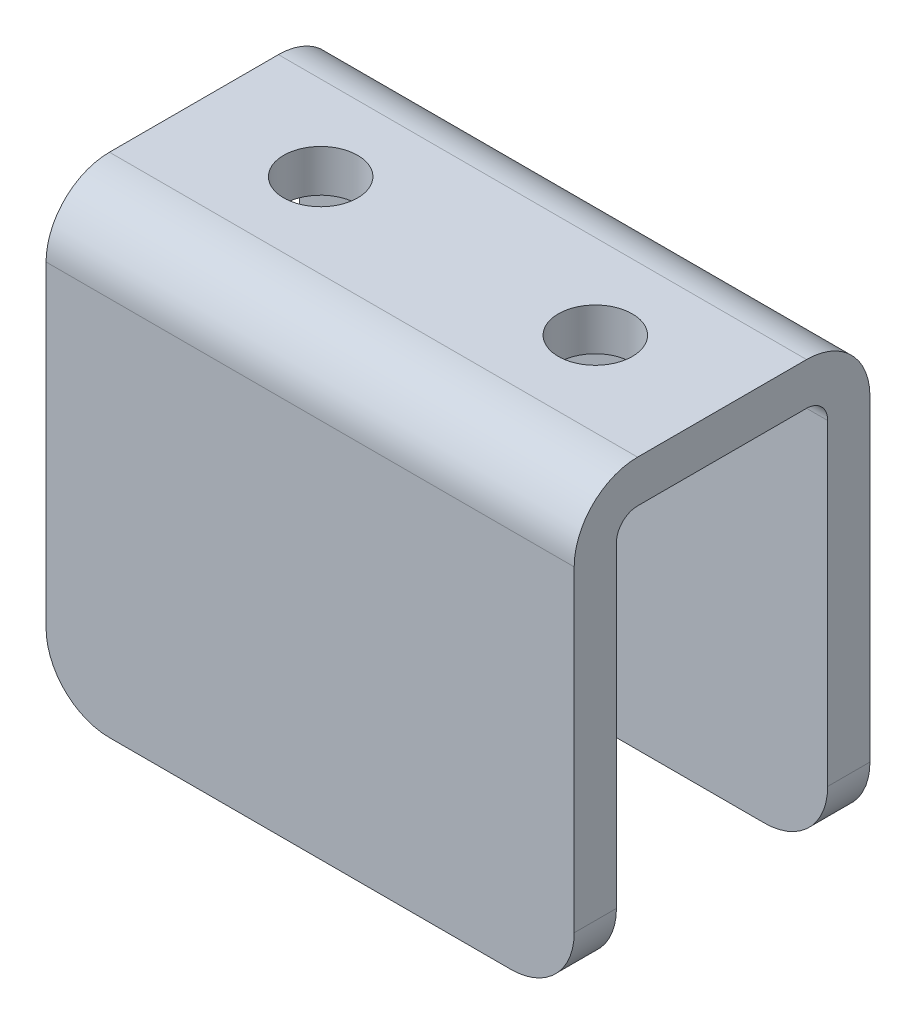
ISO-10303-21;
HEADER;
FILE_DESCRIPTION(('STEP AP214'),'2;1');
FILE_NAME('part.step','',(''),(''),'','','');
FILE_SCHEMA(('AUTOMOTIVE_DESIGN { 1 0 10303 214 1 1 1 1 }'));
ENDSEC;
DATA;
#1=APPLICATION_CONTEXT('core data for automotive mechanical design processes');
#2=APPLICATION_PROTOCOL_DEFINITION('international standard','automotive_design',2000,#1);
#3=PRODUCT_CONTEXT('',#1,'mechanical');
#4=PRODUCT('Part','Part','',(#3));
#5=PRODUCT_RELATED_PRODUCT_CATEGORY('part','',(#4));
#6=PRODUCT_DEFINITION_FORMATION('','',#4);
#7=PRODUCT_DEFINITION_CONTEXT('part definition',#1,'design');
#8=PRODUCT_DEFINITION('design','',#6,#7);
#9=PRODUCT_DEFINITION_SHAPE('','',#8);
#10=(LENGTH_UNIT() NAMED_UNIT(*) SI_UNIT(.MILLI.,.METRE.));
#11=(NAMED_UNIT(*) PLANE_ANGLE_UNIT() SI_UNIT($,.RADIAN.));
#12=(NAMED_UNIT(*) SI_UNIT($,.STERADIAN.) SOLID_ANGLE_UNIT());
#13=UNCERTAINTY_MEASURE_WITH_UNIT(LENGTH_MEASURE(1.E-05),#10,'distance_accuracy_value','');
#14=(GEOMETRIC_REPRESENTATION_CONTEXT(3) GLOBAL_UNCERTAINTY_ASSIGNED_CONTEXT((#13)) GLOBAL_UNIT_ASSIGNED_CONTEXT((#10,
#11,#12)) REPRESENTATION_CONTEXT('',''));
#15=CARTESIAN_POINT('',(0.,0.,0.));
#16=DIRECTION('',(0.,0.,1.));
#17=DIRECTION('',(1.,0.,0.));
#18=AXIS2_PLACEMENT_3D('',#15,#16,#17);
#19=CARTESIAN_POINT('',(67.,94.,8.));
#20=DIRECTION('',(0.,1.,0.));
#21=DIRECTION('',(0.,0.,1.));
#22=AXIS2_PLACEMENT_3D('',#19,#20,#21);
#23=PLANE('',#22);
#24=DIRECTION('',(0.,0.,1.));
#25=VECTOR('',#24,1.);
#26=CARTESIAN_POINT('',(45.,94.,3.));
#27=LINE('',#26,#25);
#28=CARTESIAN_POINT('',(45.,94.,8.));
#29=VERTEX_POINT('',#28);
#30=CARTESIAN_POINT('',(45.,94.,10.));
#31=VERTEX_POINT('',#30);
#32=EDGE_CURVE('E203',#29,#31,#27,.T.);
#33=ORIENTED_EDGE('',*,*,#32,.F.);
#34=DIRECTION('',(1.,0.,0.));
#35=VECTOR('',#34,1.);
#36=CARTESIAN_POINT('',(67.,94.,8.));
#37=LINE('',#36,#35);
#38=CARTESIAN_POINT('',(64.,94.,8.));
#39=VERTEX_POINT('',#38);
#40=EDGE_CURVE('E178',#29,#39,#37,.T.);
#41=ORIENTED_EDGE('',*,*,#40,.T.);
#42=DIRECTION('',(0.,0.,1.));
#43=VECTOR('',#42,1.);
#44=CARTESIAN_POINT('',(64.,94.,3.));
#45=LINE('',#44,#43);
#46=CARTESIAN_POINT('',(64.,94.,10.));
#47=VERTEX_POINT('',#46);
#48=EDGE_CURVE('E216',#47,#39,#45,.F.);
#49=ORIENTED_EDGE('',*,*,#48,.F.);
#50=DIRECTION('',(1.,0.,0.));
#51=VECTOR('',#50,1.);
#52=CARTESIAN_POINT('',(67.,94.,10.));
#53=LINE('',#52,#51);
#54=EDGE_CURVE('E194',#47,#31,#53,.F.);
#55=ORIENTED_EDGE('',*,*,#54,.T.);
#56=EDGE_LOOP('',(#33,#41,#49,#55));
#57=FACE_BOUND('',#56,.T.);
#58=ADVANCED_FACE('F16',(#57),#23,.F.);
#59=CARTESIAN_POINT('',(61.,117.1000024,3.));
#60=DIRECTION('',(0.,-1.,0.));
#61=DIRECTION('',(0.,0.,-1.));
#62=AXIS2_PLACEMENT_3D('',#59,#60,#61);
#63=CYLINDRICAL_SURFACE('',#62,1.75);
#64=CARTESIAN_POINT('',(61.,113.,3.));
#65=DIRECTION('',(0.,-1.,0.));
#66=DIRECTION('',(0.,0.,-1.));
#67=AXIS2_PLACEMENT_3D('',#64,#65,#66);
#68=CIRCLE('',#67,1.75);
#69=CARTESIAN_POINT('',(61.,113.,1.25));
#70=VERTEX_POINT('',#69);
#71=EDGE_CURVE('E193',#70,#70,#68,.T.);
#72=ORIENTED_EDGE('',*,*,#71,.T.);
#73=EDGE_LOOP('',(#72));
#74=FACE_BOUND('',#73,.T.);
#75=CARTESIAN_POINT('',(61.,115.,3.));
#76=DIRECTION('',(0.,-1.,0.));
#77=DIRECTION('',(0.,0.,-1.));
#78=AXIS2_PLACEMENT_3D('',#75,#76,#77);
#79=CIRCLE('',#78,1.75);
#80=CARTESIAN_POINT('',(61.,115.,1.25));
#81=VERTEX_POINT('',#80);
#82=EDGE_CURVE('E211',#81,#81,#79,.F.);
#83=ORIENTED_EDGE('',*,*,#82,.T.);
#84=EDGE_LOOP('',(#83));
#85=FACE_BOUND('',#84,.T.);
#86=ADVANCED_FACE('F539',(#74,#85),#63,.F.);
#87=CARTESIAN_POINT('',(48.,117.1000024,3.));
#88=DIRECTION('',(0.,-1.,0.));
#89=DIRECTION('',(0.,0.,-1.));
#90=AXIS2_PLACEMENT_3D('',#87,#88,#89);
#91=CYLINDRICAL_SURFACE('',#90,1.75);
#92=CARTESIAN_POINT('',(48.,113.,3.));
#93=DIRECTION('',(0.,-1.,0.));
#94=DIRECTION('',(0.,0.,-1.));
#95=AXIS2_PLACEMENT_3D('',#92,#93,#94);
#96=CIRCLE('',#95,1.75);
#97=CARTESIAN_POINT('',(48.,113.,1.25));
#98=VERTEX_POINT('',#97);
#99=EDGE_CURVE('E143',#98,#98,#96,.T.);
#100=ORIENTED_EDGE('',*,*,#99,.T.);
#101=EDGE_LOOP('',(#100));
#102=FACE_BOUND('',#101,.T.);
#103=CARTESIAN_POINT('',(48.,115.,3.));
#104=DIRECTION('',(0.,-1.,0.));
#105=DIRECTION('',(0.,0.,-1.));
#106=AXIS2_PLACEMENT_3D('',#103,#104,#105);
#107=CIRCLE('',#106,1.75);
#108=CARTESIAN_POINT('',(48.,115.,1.25));
#109=VERTEX_POINT('',#108);
#110=EDGE_CURVE('E215',#109,#109,#107,.F.);
#111=ORIENTED_EDGE('',*,*,#110,.T.);
#112=EDGE_LOOP('',(#111));
#113=FACE_BOUND('',#112,.T.);
#114=ADVANCED_FACE('F530',(#102,#113),#91,.F.);
#115=CARTESIAN_POINT('',(67.,112.,7.));
#116=DIRECTION('',(-1.,0.,0.));
#117=DIRECTION('',(0.,0.,1.));
#118=AXIS2_PLACEMENT_3D('',#115,#116,#117);
#119=CYLINDRICAL_SURFACE('',#118,1.);
#120=CARTESIAN_POINT('',(42.,112.,7.));
#121=DIRECTION('',(-1.,0.,0.));
#122=DIRECTION('',(0.,0.,1.));
#123=AXIS2_PLACEMENT_3D('',#120,#121,#122);
#124=CIRCLE('',#123,1.);
#125=CARTESIAN_POINT('',(42.,113.,7.));
#126=VERTEX_POINT('',#125);
#127=CARTESIAN_POINT('',(42.,112.,8.));
#128=VERTEX_POINT('',#127);
#129=EDGE_CURVE('E135',#126,#128,#124,.F.);
#130=ORIENTED_EDGE('',*,*,#129,.F.);
#131=DIRECTION('',(1.,0.,0.));
#132=VECTOR('',#131,1.);
#133=CARTESIAN_POINT('',(67.,113.,7.));
#134=LINE('',#133,#132);
#135=CARTESIAN_POINT('',(67.,113.,7.));
#136=VERTEX_POINT('',#135);
#137=EDGE_CURVE('E137',#126,#136,#134,.T.);
#138=ORIENTED_EDGE('',*,*,#137,.T.);
#139=CARTESIAN_POINT('',(67.,112.,7.));
#140=DIRECTION('',(-1.,0.,0.));
#141=DIRECTION('',(0.,0.,1.));
#142=AXIS2_PLACEMENT_3D('',#139,#140,#141);
#143=CIRCLE('',#142,1.);
#144=CARTESIAN_POINT('',(67.,112.,8.));
#145=VERTEX_POINT('',#144);
#146=EDGE_CURVE('E19',#145,#136,#143,.T.);
#147=ORIENTED_EDGE('',*,*,#146,.F.);
#148=DIRECTION('',(1.,0.,0.));
#149=VECTOR('',#148,1.);
#150=CARTESIAN_POINT('',(67.,112.,8.));
#151=LINE('',#150,#149);
#152=EDGE_CURVE('E190',#145,#128,#151,.F.);
#153=ORIENTED_EDGE('',*,*,#152,.T.);
#154=EDGE_LOOP('',(#130,#138,#147,#153));
#155=FACE_BOUND('',#154,.T.);
#156=ADVANCED_FACE('F138',(#155),#119,.F.);
#157=CARTESIAN_POINT('',(64.,97.,3.));
#158=DIRECTION('',(0.,0.,1.));
#159=DIRECTION('',(0.,-1.,0.));
#160=AXIS2_PLACEMENT_3D('',#157,#158,#159);
#161=CYLINDRICAL_SURFACE('',#160,3.);
#162=ORIENTED_EDGE('',*,*,#48,.T.);
#163=CARTESIAN_POINT('',(64.,97.,8.));
#164=DIRECTION('',(0.,0.,1.));
#165=DIRECTION('',(0.,-1.,0.));
#166=AXIS2_PLACEMENT_3D('',#163,#164,#165);
#167=CIRCLE('',#166,3.);
#168=CARTESIAN_POINT('',(67.,97.,8.));
#169=VERTEX_POINT('',#168);
#170=EDGE_CURVE('E182',#39,#169,#167,.T.);
#171=ORIENTED_EDGE('',*,*,#170,.T.);
#172=DIRECTION('',(0.,0.,-1.));
#173=VECTOR('',#172,1.);
#174=CARTESIAN_POINT('',(67.,97.,3.));
#175=LINE('',#174,#173);
#176=CARTESIAN_POINT('',(67.,97.,10.));
#177=VERTEX_POINT('',#176);
#178=EDGE_CURVE('E160',#177,#169,#175,.T.);
#179=ORIENTED_EDGE('',*,*,#178,.F.);
#180=CARTESIAN_POINT('',(64.,97.,10.));
#181=DIRECTION('',(0.,0.,1.));
#182=DIRECTION('',(0.,-1.,0.));
#183=AXIS2_PLACEMENT_3D('',#180,#181,#182);
#184=CIRCLE('',#183,3.);
#185=EDGE_CURVE('E199',#177,#47,#184,.F.);
#186=ORIENTED_EDGE('',*,*,#185,.T.);
#187=EDGE_LOOP('',(#162,#171,#179,#186));
#188=FACE_BOUND('',#187,.T.);
#189=ADVANCED_FACE('F366',(#188),#161,.T.);
#190=CARTESIAN_POINT('',(67.,114.,-4.));
#191=DIRECTION('',(0.,0.,1.));
#192=DIRECTION('',(1.,0.,0.));
#193=AXIS2_PLACEMENT_3D('',#190,#191,#192);
#194=PLANE('',#193);
#195=DIRECTION('',(0.,1.,0.));
#196=VECTOR('',#195,1.);
#197=CARTESIAN_POINT('',(67.,84.,-4.));
#198=LINE('',#197,#196);
#199=CARTESIAN_POINT('',(67.,97.,-4.));
#200=VERTEX_POINT('',#199);
#201=CARTESIAN_POINT('',(67.,112.,-4.));
#202=VERTEX_POINT('',#201);
#203=EDGE_CURVE('E142',#200,#202,#198,.T.);
#204=ORIENTED_EDGE('',*,*,#203,.F.);
#205=CARTESIAN_POINT('',(64.,97.,-4.));
#206=DIRECTION('',(0.,0.,1.));
#207=DIRECTION('',(1.,0.,0.));
#208=AXIS2_PLACEMENT_3D('',#205,#206,#207);
#209=CIRCLE('',#208,3.);
#210=CARTESIAN_POINT('',(64.,94.,-4.));
#211=VERTEX_POINT('',#210);
#212=EDGE_CURVE('E157',#211,#200,#209,.T.);
#213=ORIENTED_EDGE('',*,*,#212,.F.);
#214=DIRECTION('',(1.,0.,0.));
#215=VECTOR('',#214,1.);
#216=CARTESIAN_POINT('',(67.,94.,-4.));
#217=LINE('',#216,#215);
#218=CARTESIAN_POINT('',(45.,94.,-4.));
#219=VERTEX_POINT('',#218);
#220=EDGE_CURVE('E217',#211,#219,#217,.F.);
#221=ORIENTED_EDGE('',*,*,#220,.T.);
#222=CARTESIAN_POINT('',(45.,97.,-4.));
#223=DIRECTION('',(0.,0.,1.));
#224=DIRECTION('',(1.,0.,0.));
#225=AXIS2_PLACEMENT_3D('',#222,#223,#224);
#226=CIRCLE('',#225,3.);
#227=CARTESIAN_POINT('',(42.,97.,-4.));
#228=VERTEX_POINT('',#227);
#229=EDGE_CURVE('E221',#228,#219,#226,.T.);
#230=ORIENTED_EDGE('',*,*,#229,.F.);
#231=DIRECTION('',(0.,1.,0.));
#232=VECTOR('',#231,1.);
#233=CARTESIAN_POINT('',(42.,84.,-4.));
#234=LINE('',#233,#232);
#235=CARTESIAN_POINT('',(42.,112.,-4.));
#236=VERTEX_POINT('',#235);
#237=EDGE_CURVE('E254',#228,#236,#234,.T.);
#238=ORIENTED_EDGE('',*,*,#237,.T.);
#239=DIRECTION('',(1.,0.,0.));
#240=VECTOR('',#239,1.);
#241=CARTESIAN_POINT('',(67.,112.,-4.));
#242=LINE('',#241,#240);
#243=EDGE_CURVE('E212',#202,#236,#242,.F.);
#244=ORIENTED_EDGE('',*,*,#243,.F.);
#245=EDGE_LOOP('',(#204,#213,#221,#230,#238,#244));
#246=FACE_BOUND('',#245,.T.);
#247=ADVANCED_FACE('F347',(#246),#194,.F.);
#248=CARTESIAN_POINT('',(67.,112.,-1.));
#249=DIRECTION('',(1.,0.,0.));
#250=DIRECTION('',(0.,0.,-1.));
#251=AXIS2_PLACEMENT_3D('',#248,#249,#250);
#252=CYLINDRICAL_SURFACE('',#251,3.);
#253=DIRECTION('',(1.,0.,0.));
#254=VECTOR('',#253,1.);
#255=CARTESIAN_POINT('',(67.,115.,-1.));
#256=LINE('',#255,#254);
#257=CARTESIAN_POINT('',(42.,115.,-1.));
#258=VERTEX_POINT('',#257);
#259=CARTESIAN_POINT('',(67.,115.,-1.));
#260=VERTEX_POINT('',#259);
#261=EDGE_CURVE('E207',#258,#260,#256,.T.);
#262=ORIENTED_EDGE('',*,*,#261,.T.);
#263=CARTESIAN_POINT('',(67.,112.,-1.));
#264=DIRECTION('',(1.,0.,0.));
#265=DIRECTION('',(0.,0.,-1.));
#266=AXIS2_PLACEMENT_3D('',#263,#264,#265);
#267=CIRCLE('',#266,3.);
#268=EDGE_CURVE('E172',#202,#260,#267,.T.);
#269=ORIENTED_EDGE('',*,*,#268,.F.);
#270=ORIENTED_EDGE('',*,*,#243,.T.);
#271=CARTESIAN_POINT('',(42.,112.,-1.));
#272=DIRECTION('',(1.,0.,0.));
#273=DIRECTION('',(0.,0.,-1.));
#274=AXIS2_PLACEMENT_3D('',#271,#272,#273);
#275=CIRCLE('',#274,3.);
#276=EDGE_CURVE('E250',#236,#258,#275,.T.);
#277=ORIENTED_EDGE('',*,*,#276,.T.);
#278=EDGE_LOOP('',(#262,#269,#270,#277));
#279=FACE_BOUND('',#278,.T.);
#280=ADVANCED_FACE('F353',(#279),#252,.T.);
#281=CARTESIAN_POINT('',(67.,115.,9.));
#282=DIRECTION('',(0.,-1.,0.));
#283=DIRECTION('',(0.,0.,-1.));
#284=AXIS2_PLACEMENT_3D('',#281,#282,#283);
#285=PLANE('',#284);
#286=DIRECTION('',(0.,0.,-1.));
#287=VECTOR('',#286,1.);
#288=CARTESIAN_POINT('',(67.,115.,3.));
#289=LINE('',#288,#287);
#290=CARTESIAN_POINT('',(67.,115.,7.));
#291=VERTEX_POINT('',#290);
#292=EDGE_CURVE('E169',#260,#291,#289,.F.);
#293=ORIENTED_EDGE('',*,*,#292,.F.);
#294=ORIENTED_EDGE('',*,*,#261,.F.);
#295=DIRECTION('',(0.,0.,-1.));
#296=VECTOR('',#295,1.);
#297=CARTESIAN_POINT('',(42.,115.,3.));
#298=LINE('',#297,#296);
#299=CARTESIAN_POINT('',(42.,115.,7.));
#300=VERTEX_POINT('',#299);
#301=EDGE_CURVE('E249',#258,#300,#298,.F.);
#302=ORIENTED_EDGE('',*,*,#301,.T.);
#303=DIRECTION('',(1.,0.,0.));
#304=VECTOR('',#303,1.);
#305=CARTESIAN_POINT('',(67.,115.,7.));
#306=LINE('',#305,#304);
#307=EDGE_CURVE('E204',#291,#300,#306,.F.);
#308=ORIENTED_EDGE('',*,*,#307,.F.);
#309=EDGE_LOOP('',(#293,#294,#302,#308));
#310=FACE_BOUND('',#309,.T.);
#311=ORIENTED_EDGE('',*,*,#82,.F.);
#312=EDGE_LOOP('',(#311));
#313=FACE_BOUND('',#312,.T.);
#314=ORIENTED_EDGE('',*,*,#110,.F.);
#315=EDGE_LOOP('',(#314));
#316=FACE_BOUND('',#315,.T.);
#317=ADVANCED_FACE('F356',(#310,#313,#316),#285,.F.);
#318=CARTESIAN_POINT('',(67.,112.,7.));
#319=DIRECTION('',(1.,0.,0.));
#320=DIRECTION('',(0.,0.,-1.));
#321=AXIS2_PLACEMENT_3D('',#318,#319,#320);
#322=CYLINDRICAL_SURFACE('',#321,3.);
#323=DIRECTION('',(1.,0.,0.));
#324=VECTOR('',#323,1.);
#325=CARTESIAN_POINT('',(67.,112.,10.));
#326=LINE('',#325,#324);
#327=CARTESIAN_POINT('',(42.,112.,10.));
#328=VERTEX_POINT('',#327);
#329=CARTESIAN_POINT('',(67.,112.,10.));
#330=VERTEX_POINT('',#329);
#331=EDGE_CURVE('E198',#328,#330,#326,.T.);
#332=ORIENTED_EDGE('',*,*,#331,.T.);
#333=CARTESIAN_POINT('',(67.,112.,7.));
#334=DIRECTION('',(1.,0.,0.));
#335=DIRECTION('',(0.,0.,-1.));
#336=AXIS2_PLACEMENT_3D('',#333,#334,#335);
#337=CIRCLE('',#336,3.);
#338=EDGE_CURVE('E168',#291,#330,#337,.T.);
#339=ORIENTED_EDGE('',*,*,#338,.F.);
#340=ORIENTED_EDGE('',*,*,#307,.T.);
#341=CARTESIAN_POINT('',(42.,112.,7.));
#342=DIRECTION('',(1.,0.,0.));
#343=DIRECTION('',(0.,0.,-1.));
#344=AXIS2_PLACEMENT_3D('',#341,#342,#343);
#345=CIRCLE('',#344,3.);
#346=EDGE_CURVE('E245',#300,#328,#345,.T.);
#347=ORIENTED_EDGE('',*,*,#346,.T.);
#348=EDGE_LOOP('',(#332,#339,#340,#347));
#349=FACE_BOUND('',#348,.T.);
#350=ADVANCED_FACE('F361',(#349),#322,.T.);
#351=CARTESIAN_POINT('',(67.,94.,10.));
#352=DIRECTION('',(0.,0.,-1.));
#353=DIRECTION('',(0.,1.,0.));
#354=AXIS2_PLACEMENT_3D('',#351,#352,#353);
#355=PLANE('',#354);
#356=DIRECTION('',(0.,1.,0.));
#357=VECTOR('',#356,1.);
#358=CARTESIAN_POINT('',(42.,84.,10.));
#359=LINE('',#358,#357);
#360=CARTESIAN_POINT('',(42.,97.,10.));
#361=VERTEX_POINT('',#360);
#362=EDGE_CURVE('E189',#328,#361,#359,.F.);
#363=ORIENTED_EDGE('',*,*,#362,.T.);
#364=CARTESIAN_POINT('',(45.,97.,10.));
#365=DIRECTION('',(0.,0.,1.));
#366=DIRECTION('',(0.,-1.,0.));
#367=AXIS2_PLACEMENT_3D('',#364,#365,#366);
#368=CIRCLE('',#367,3.);
#369=EDGE_CURVE('E229',#31,#361,#368,.F.);
#370=ORIENTED_EDGE('',*,*,#369,.F.);
#371=ORIENTED_EDGE('',*,*,#54,.F.);
#372=ORIENTED_EDGE('',*,*,#185,.F.);
#373=DIRECTION('',(0.,1.,0.));
#374=VECTOR('',#373,1.);
#375=CARTESIAN_POINT('',(67.,84.,10.));
#376=LINE('',#375,#374);
#377=EDGE_CURVE('E164',#330,#177,#376,.F.);
#378=ORIENTED_EDGE('',*,*,#377,.F.);
#379=ORIENTED_EDGE('',*,*,#331,.F.);
#380=EDGE_LOOP('',(#363,#370,#371,#372,#378,#379));
#381=FACE_BOUND('',#380,.T.);
#382=ADVANCED_FACE('F374',(#381),#355,.F.);
#383=CARTESIAN_POINT('',(45.,97.,3.));
#384=DIRECTION('',(0.,0.,1.));
#385=DIRECTION('',(0.,-1.,0.));
#386=AXIS2_PLACEMENT_3D('',#383,#384,#385);
#387=CYLINDRICAL_SURFACE('',#386,3.);
#388=ORIENTED_EDGE('',*,*,#32,.T.);
#389=ORIENTED_EDGE('',*,*,#369,.T.);
#390=DIRECTION('',(0.,0.,-1.));
#391=VECTOR('',#390,1.);
#392=CARTESIAN_POINT('',(42.,97.,3.));
#393=LINE('',#392,#391);
#394=CARTESIAN_POINT('',(42.,97.,8.));
#395=VERTEX_POINT('',#394);
#396=EDGE_CURVE('E184',#361,#395,#393,.T.);
#397=ORIENTED_EDGE('',*,*,#396,.T.);
#398=CARTESIAN_POINT('',(45.,97.,8.));
#399=DIRECTION('',(0.,0.,1.));
#400=DIRECTION('',(0.,-1.,0.));
#401=AXIS2_PLACEMENT_3D('',#398,#399,#400);
#402=CIRCLE('',#401,3.);
#403=EDGE_CURVE('E183',#395,#29,#402,.T.);
#404=ORIENTED_EDGE('',*,*,#403,.T.);
#405=EDGE_LOOP('',(#388,#389,#397,#404));
#406=FACE_BOUND('',#405,.T.);
#407=ADVANCED_FACE('F372',(#406),#387,.T.);
#408=CARTESIAN_POINT('',(67.,113.,8.));
#409=DIRECTION('',(0.,0.,1.));
#410=DIRECTION('',(1.,0.,0.));
#411=AXIS2_PLACEMENT_3D('',#408,#409,#410);
#412=PLANE('',#411);
#413=DIRECTION('',(0.,1.,0.));
#414=VECTOR('',#413,1.);
#415=CARTESIAN_POINT('',(67.,84.,8.));
#416=LINE('',#415,#414);
#417=EDGE_CURVE('E133',#169,#145,#416,.T.);
#418=ORIENTED_EDGE('',*,*,#417,.F.);
#419=ORIENTED_EDGE('',*,*,#170,.F.);
#420=ORIENTED_EDGE('',*,*,#40,.F.);
#421=ORIENTED_EDGE('',*,*,#403,.F.);
#422=DIRECTION('',(0.,1.,0.));
#423=VECTOR('',#422,1.);
#424=CARTESIAN_POINT('',(42.,84.,8.));
#425=LINE('',#424,#423);
#426=EDGE_CURVE('E188',#395,#128,#425,.T.);
#427=ORIENTED_EDGE('',*,*,#426,.T.);
#428=ORIENTED_EDGE('',*,*,#152,.F.);
#429=EDGE_LOOP('',(#418,#419,#420,#421,#427,#428));
#430=FACE_BOUND('',#429,.T.);
#431=ADVANCED_FACE('F296',(#430),#412,.F.);
#432=CARTESIAN_POINT('',(67.,113.,-2.));
#433=DIRECTION('',(0.,1.,0.));
#434=DIRECTION('',(0.,0.,1.));
#435=AXIS2_PLACEMENT_3D('',#432,#433,#434);
#436=PLANE('',#435);
#437=DIRECTION('',(0.,0.,-1.));
#438=VECTOR('',#437,1.);
#439=CARTESIAN_POINT('',(67.,113.,3.));
#440=LINE('',#439,#438);
#441=CARTESIAN_POINT('',(67.,113.,-1.));
#442=VERTEX_POINT('',#441);
#443=EDGE_CURVE('E130',#136,#442,#440,.T.);
#444=ORIENTED_EDGE('',*,*,#443,.F.);
#445=ORIENTED_EDGE('',*,*,#137,.F.);
#446=DIRECTION('',(0.,0.,-1.));
#447=VECTOR('',#446,1.);
#448=CARTESIAN_POINT('',(42.,113.,3.));
#449=LINE('',#448,#447);
#450=CARTESIAN_POINT('',(42.,113.,-1.));
#451=VERTEX_POINT('',#450);
#452=EDGE_CURVE('E294',#126,#451,#449,.T.);
#453=ORIENTED_EDGE('',*,*,#452,.T.);
#454=DIRECTION('',(-1.,0.,0.));
#455=VECTOR('',#454,1.);
#456=CARTESIAN_POINT('',(67.,113.,-1.));
#457=LINE('',#456,#455);
#458=EDGE_CURVE('E148',#451,#442,#457,.F.);
#459=ORIENTED_EDGE('',*,*,#458,.T.);
#460=EDGE_LOOP('',(#444,#445,#453,#459));
#461=FACE_BOUND('',#460,.T.);
#462=ORIENTED_EDGE('',*,*,#99,.F.);
#463=EDGE_LOOP('',(#462));
#464=FACE_BOUND('',#463,.T.);
#465=ORIENTED_EDGE('',*,*,#71,.F.);
#466=EDGE_LOOP('',(#465));
#467=FACE_BOUND('',#466,.T.);
#468=ADVANCED_FACE('F146',(#461,#464,#467),#436,.F.);
#469=CARTESIAN_POINT('',(67.,84.,3.));
#470=DIRECTION('',(1.,0.,0.));
#471=DIRECTION('',(0.,0.,-1.));
#472=AXIS2_PLACEMENT_3D('',#469,#470,#471);
#473=PLANE('',#472);
#474=CARTESIAN_POINT('',(67.,112.,-1.));
#475=DIRECTION('',(-1.,0.,0.));
#476=DIRECTION('',(0.,0.,1.));
#477=AXIS2_PLACEMENT_3D('',#474,#475,#476);
#478=CIRCLE('',#477,1.);
#479=CARTESIAN_POINT('',(67.,112.,-2.));
#480=VERTEX_POINT('',#479);
#481=EDGE_CURVE('E241',#442,#480,#478,.T.);
#482=ORIENTED_EDGE('',*,*,#481,.T.);
#483=DIRECTION('',(0.,1.,0.));
#484=VECTOR('',#483,1.);
#485=CARTESIAN_POINT('',(67.,94.,-2.));
#486=LINE('',#485,#484);
#487=CARTESIAN_POINT('',(67.,97.,-2.));
#488=VERTEX_POINT('',#487);
#489=EDGE_CURVE('E176',#480,#488,#486,.F.);
#490=ORIENTED_EDGE('',*,*,#489,.T.);
#491=DIRECTION('',(0.,0.,1.));
#492=VECTOR('',#491,1.);
#493=CARTESIAN_POINT('',(67.,97.,3.));
#494=LINE('',#493,#492);
#495=EDGE_CURVE('E150',#200,#488,#494,.T.);
#496=ORIENTED_EDGE('',*,*,#495,.F.);
#497=ORIENTED_EDGE('',*,*,#203,.T.);
#498=ORIENTED_EDGE('',*,*,#268,.T.);
#499=ORIENTED_EDGE('',*,*,#292,.T.);
#500=ORIENTED_EDGE('',*,*,#338,.T.);
#501=ORIENTED_EDGE('',*,*,#377,.T.);
#502=ORIENTED_EDGE('',*,*,#178,.T.);
#503=ORIENTED_EDGE('',*,*,#417,.T.);
#504=ORIENTED_EDGE('',*,*,#146,.T.);
#505=ORIENTED_EDGE('',*,*,#443,.T.);
#506=EDGE_LOOP('',(#482,#490,#496,#497,#498,#499,#500,#501,#502,#503,#504,#505));
#507=FACE_BOUND('',#506,.T.);
#508=ADVANCED_FACE('F128',(#507),#473,.T.);
#509=CARTESIAN_POINT('',(64.,97.,3.));
#510=DIRECTION('',(0.,0.,1.));
#511=DIRECTION('',(1.,0.,0.));
#512=AXIS2_PLACEMENT_3D('',#509,#510,#511);
#513=CYLINDRICAL_SURFACE('',#512,3.);
#514=DIRECTION('',(0.,0.,1.));
#515=VECTOR('',#514,1.);
#516=CARTESIAN_POINT('',(64.,94.,-4.));
#517=LINE('',#516,#515);
#518=CARTESIAN_POINT('',(64.,94.,-2.));
#519=VERTEX_POINT('',#518);
#520=EDGE_CURVE('E222',#519,#211,#517,.F.);
#521=ORIENTED_EDGE('',*,*,#520,.T.);
#522=ORIENTED_EDGE('',*,*,#212,.T.);
#523=ORIENTED_EDGE('',*,*,#495,.T.);
#524=CARTESIAN_POINT('',(64.,97.,-2.));
#525=DIRECTION('',(0.,0.,1.));
#526=DIRECTION('',(1.,0.,0.));
#527=AXIS2_PLACEMENT_3D('',#524,#525,#526);
#528=CIRCLE('',#527,3.);
#529=EDGE_CURVE('E235',#488,#519,#528,.F.);
#530=ORIENTED_EDGE('',*,*,#529,.T.);
#531=EDGE_LOOP('',(#521,#522,#523,#530));
#532=FACE_BOUND('',#531,.T.);
#533=ADVANCED_FACE('F321',(#532),#513,.T.);
#534=CARTESIAN_POINT('',(67.,94.,-4.));
#535=DIRECTION('',(0.,1.,0.));
#536=DIRECTION('',(0.,0.,1.));
#537=AXIS2_PLACEMENT_3D('',#534,#535,#536);
#538=PLANE('',#537);
#539=DIRECTION('',(0.,0.,1.));
#540=VECTOR('',#539,1.);
#541=CARTESIAN_POINT('',(45.,94.,3.));
#542=LINE('',#541,#540);
#543=CARTESIAN_POINT('',(45.,94.,-2.));
#544=VERTEX_POINT('',#543);
#545=EDGE_CURVE('E256',#219,#544,#542,.T.);
#546=ORIENTED_EDGE('',*,*,#545,.F.);
#547=ORIENTED_EDGE('',*,*,#220,.F.);
#548=ORIENTED_EDGE('',*,*,#520,.F.);
#549=DIRECTION('',(-1.,0.,0.));
#550=VECTOR('',#549,1.);
#551=CARTESIAN_POINT('',(67.,94.,-2.));
#552=LINE('',#551,#550);
#553=EDGE_CURVE('E234',#519,#544,#552,.T.);
#554=ORIENTED_EDGE('',*,*,#553,.T.);
#555=EDGE_LOOP('',(#546,#547,#548,#554));
#556=FACE_BOUND('',#555,.T.);
#557=ADVANCED_FACE('F329',(#556),#538,.F.);
#558=CARTESIAN_POINT('',(45.,97.,3.));
#559=DIRECTION('',(0.,0.,1.));
#560=DIRECTION('',(1.,0.,0.));
#561=AXIS2_PLACEMENT_3D('',#558,#559,#560);
#562=CYLINDRICAL_SURFACE('',#561,3.);
#563=ORIENTED_EDGE('',*,*,#545,.T.);
#564=CARTESIAN_POINT('',(45.,97.,-2.));
#565=DIRECTION('',(0.,0.,1.));
#566=DIRECTION('',(1.,0.,0.));
#567=AXIS2_PLACEMENT_3D('',#564,#565,#566);
#568=CIRCLE('',#567,3.);
#569=CARTESIAN_POINT('',(42.,97.,-2.));
#570=VERTEX_POINT('',#569);
#571=EDGE_CURVE('E230',#544,#570,#568,.F.);
#572=ORIENTED_EDGE('',*,*,#571,.T.);
#573=DIRECTION('',(0.,0.,-1.));
#574=VECTOR('',#573,1.);
#575=CARTESIAN_POINT('',(42.,97.,3.));
#576=LINE('',#575,#574);
#577=EDGE_CURVE('E244',#570,#228,#576,.T.);
#578=ORIENTED_EDGE('',*,*,#577,.T.);
#579=ORIENTED_EDGE('',*,*,#229,.T.);
#580=EDGE_LOOP('',(#563,#572,#578,#579));
#581=FACE_BOUND('',#580,.T.);
#582=ADVANCED_FACE('F344',(#581),#562,.T.);
#583=CARTESIAN_POINT('',(42.,84.,3.));
#584=DIRECTION('',(1.,0.,0.));
#585=DIRECTION('',(0.,0.,-1.));
#586=AXIS2_PLACEMENT_3D('',#583,#584,#585);
#587=PLANE('',#586);
#588=DIRECTION('',(0.,1.,0.));
#589=VECTOR('',#588,1.);
#590=CARTESIAN_POINT('',(42.,94.,-2.));
#591=LINE('',#590,#589);
#592=CARTESIAN_POINT('',(42.,112.,-2.));
#593=VERTEX_POINT('',#592);
#594=EDGE_CURVE('E26',#570,#593,#591,.T.);
#595=ORIENTED_EDGE('',*,*,#594,.T.);
#596=CARTESIAN_POINT('',(42.,112.,-1.));
#597=DIRECTION('',(-1.,0.,0.));
#598=DIRECTION('',(0.,0.,1.));
#599=AXIS2_PLACEMENT_3D('',#596,#597,#598);
#600=CIRCLE('',#599,1.);
#601=EDGE_CURVE('E34',#593,#451,#600,.F.);
#602=ORIENTED_EDGE('',*,*,#601,.T.);
#603=ORIENTED_EDGE('',*,*,#452,.F.);
#604=ORIENTED_EDGE('',*,*,#129,.T.);
#605=ORIENTED_EDGE('',*,*,#426,.F.);
#606=ORIENTED_EDGE('',*,*,#396,.F.);
#607=ORIENTED_EDGE('',*,*,#362,.F.);
#608=ORIENTED_EDGE('',*,*,#346,.F.);
#609=ORIENTED_EDGE('',*,*,#301,.F.);
#610=ORIENTED_EDGE('',*,*,#276,.F.);
#611=ORIENTED_EDGE('',*,*,#237,.F.);
#612=ORIENTED_EDGE('',*,*,#577,.F.);
#613=EDGE_LOOP('',(#595,#602,#603,#604,#605,#606,#607,#608,#609,#610,#611,#612));
#614=FACE_BOUND('',#613,.T.);
#615=ADVANCED_FACE('F291',(#614),#587,.F.);
#616=CARTESIAN_POINT('',(67.,112.,-1.));
#617=DIRECTION('',(-1.,0.,0.));
#618=DIRECTION('',(0.,0.,1.));
#619=AXIS2_PLACEMENT_3D('',#616,#617,#618);
#620=CYLINDRICAL_SURFACE('',#619,1.);
#621=ORIENTED_EDGE('',*,*,#601,.F.);
#622=DIRECTION('',(-1.,0.,0.));
#623=VECTOR('',#622,1.);
#624=CARTESIAN_POINT('',(67.,112.,-2.));
#625=LINE('',#624,#623);
#626=EDGE_CURVE('E11',#593,#480,#625,.F.);
#627=ORIENTED_EDGE('',*,*,#626,.T.);
#628=ORIENTED_EDGE('',*,*,#481,.F.);
#629=ORIENTED_EDGE('',*,*,#458,.F.);
#630=EDGE_LOOP('',(#621,#627,#628,#629));
#631=FACE_BOUND('',#630,.T.);
#632=ADVANCED_FACE('F384',(#631),#620,.F.);
#633=CARTESIAN_POINT('',(67.,94.,-2.));
#634=DIRECTION('',(0.,0.,-1.));
#635=DIRECTION('',(-1.,0.,0.));
#636=AXIS2_PLACEMENT_3D('',#633,#634,#635);
#637=PLANE('',#636);
#638=ORIENTED_EDGE('',*,*,#594,.F.);
#639=ORIENTED_EDGE('',*,*,#571,.F.);
#640=ORIENTED_EDGE('',*,*,#553,.F.);
#641=ORIENTED_EDGE('',*,*,#529,.F.);
#642=ORIENTED_EDGE('',*,*,#489,.F.);
#643=ORIENTED_EDGE('',*,*,#626,.F.);
#644=EDGE_LOOP('',(#638,#639,#640,#641,#642,#643));
#645=FACE_BOUND('',#644,.T.);
#646=ADVANCED_FACE('F333',(#645),#637,.F.);
#647=CLOSED_SHELL('',(#58,#86,#114,#156,#189,#247,#280,#317,#350,#382,#407,#431,#468,#508,#533,
#557,#582,#615,#632,#646));
#648=MANIFOLD_SOLID_BREP('B1',#647);
#649=ADVANCED_BREP_SHAPE_REPRESENTATION('',(#18,#648),#14);
#650=SHAPE_DEFINITION_REPRESENTATION(#9,#649);
ENDSEC;
END-ISO-10303-21;
